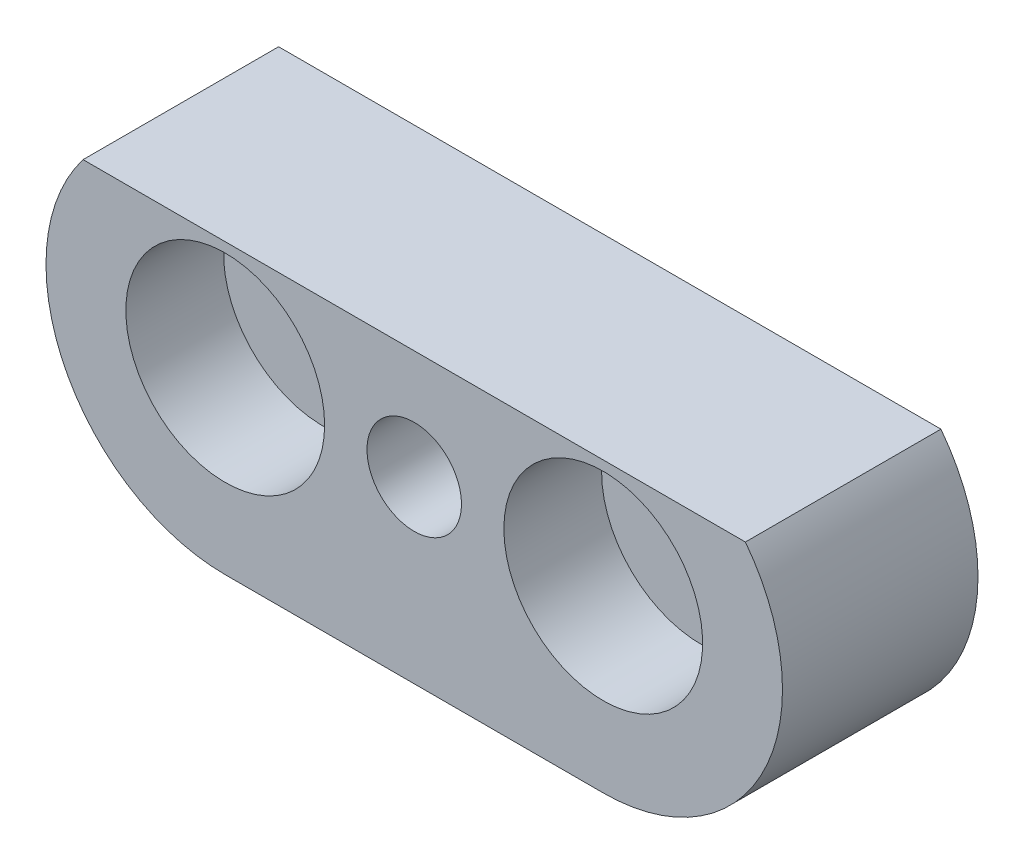
ISO-10303-21;
HEADER;
FILE_DESCRIPTION(('STEP AP214'),'2;1');
FILE_NAME('part.step','',(''),(''),'','','');
FILE_SCHEMA(('AUTOMOTIVE_DESIGN { 1 0 10303 214 1 1 1 1 }'));
ENDSEC;
DATA;
#1=APPLICATION_CONTEXT('core data for automotive mechanical design processes');
#2=APPLICATION_PROTOCOL_DEFINITION('international standard','automotive_design',2000,#1);
#3=PRODUCT_CONTEXT('',#1,'mechanical');
#4=PRODUCT('Part','Part','',(#3));
#5=PRODUCT_RELATED_PRODUCT_CATEGORY('part','',(#4));
#6=PRODUCT_DEFINITION_FORMATION('','',#4);
#7=PRODUCT_DEFINITION_CONTEXT('part definition',#1,'design');
#8=PRODUCT_DEFINITION('design','',#6,#7);
#9=PRODUCT_DEFINITION_SHAPE('','',#8);
#10=(LENGTH_UNIT() NAMED_UNIT(*) SI_UNIT(.MILLI.,.METRE.));
#11=(NAMED_UNIT(*) PLANE_ANGLE_UNIT() SI_UNIT($,.RADIAN.));
#12=(NAMED_UNIT(*) SI_UNIT($,.STERADIAN.) SOLID_ANGLE_UNIT());
#13=UNCERTAINTY_MEASURE_WITH_UNIT(LENGTH_MEASURE(1.E-05),#10,'distance_accuracy_value','');
#14=(GEOMETRIC_REPRESENTATION_CONTEXT(3) GLOBAL_UNCERTAINTY_ASSIGNED_CONTEXT((#13)) GLOBAL_UNIT_ASSIGNED_CONTEXT((#10,
#11,#12)) REPRESENTATION_CONTEXT('',''));
#15=CARTESIAN_POINT('',(0.,0.,0.));
#16=DIRECTION('',(0.,0.,1.));
#17=DIRECTION('',(1.,0.,0.));
#18=AXIS2_PLACEMENT_3D('',#15,#16,#17);
#19=CARTESIAN_POINT('',(-5.8,3.34999999999999,0.));
#20=DIRECTION('',(0.,0.,1.));
#21=DIRECTION('',(1.,0.,0.));
#22=AXIS2_PLACEMENT_3D('',#19,#20,#21);
#23=PLANE('',#22);
#24=CARTESIAN_POINT('',(-5.8,3.34999999999999,0.));
#25=DIRECTION('',(0.,0.,1.));
#26=DIRECTION('',(1.,0.,0.));
#27=AXIS2_PLACEMENT_3D('',#24,#25,#26);
#28=CIRCLE('',#27,3.1);
#29=CARTESIAN_POINT('',(-2.7,3.34999999999999,0.));
#30=VERTEX_POINT('',#29);
#31=EDGE_CURVE('E159',#30,#30,#28,.T.);
#32=ORIENTED_EDGE('',*,*,#31,.T.);
#33=EDGE_LOOP('',(#32));
#34=FACE_BOUND('',#33,.T.);
#35=CARTESIAN_POINT('',(5.8,3.34999999999999,0.));
#36=DIRECTION('',(0.,0.,-1.));
#37=DIRECTION('',(-1.,0.,0.));
#38=AXIS2_PLACEMENT_3D('',#35,#36,#37);
#39=CIRCLE('',#38,3.1);
#40=CARTESIAN_POINT('',(2.7,3.34999999999999,0.));
#41=VERTEX_POINT('',#40);
#42=EDGE_CURVE('E154',#41,#41,#39,.T.);
#43=ORIENTED_EDGE('',*,*,#42,.F.);
#44=EDGE_LOOP('',(#43));
#45=FACE_BOUND('',#44,.T.);
#46=CARTESIAN_POINT('',(0.,3.34999999999999,0.));
#47=DIRECTION('',(0.,0.,1.));
#48=DIRECTION('',(1.,0.,0.));
#49=AXIS2_PLACEMENT_3D('',#46,#47,#48);
#50=CIRCLE('',#49,1.45);
#51=CARTESIAN_POINT('',(1.45,3.34999999999999,0.));
#52=VERTEX_POINT('',#51);
#53=EDGE_CURVE('E138',#52,#52,#50,.T.);
#54=ORIENTED_EDGE('',*,*,#53,.T.);
#55=EDGE_LOOP('',(#54));
#56=FACE_BOUND('',#55,.T.);
#57=CARTESIAN_POINT('',(-5.8,3.34999999999999,0.));
#58=DIRECTION('',(0.,0.,1.));
#59=DIRECTION('',(1.,0.,0.));
#60=AXIS2_PLACEMENT_3D('',#57,#58,#59);
#61=CIRCLE('',#60,5.5);
#62=CARTESIAN_POINT('',(-5.8,-2.15000000000001,0.));
#63=VERTEX_POINT('',#62);
#64=CARTESIAN_POINT('',(-10.1620522692878,6.7000000000001,0.));
#65=VERTEX_POINT('',#64);
#66=EDGE_CURVE('E130',#63,#65,#61,.F.);
#67=ORIENTED_EDGE('',*,*,#66,.T.);
#68=DIRECTION('',(-1.,0.,0.));
#69=VECTOR('',#68,1.);
#70=CARTESIAN_POINT('',(-10.1620522692878,6.7000000000001,0.));
#71=LINE('',#70,#69);
#72=CARTESIAN_POINT('',(10.1620522692878,6.7000000000001,0.));
#73=VERTEX_POINT('',#72);
#74=EDGE_CURVE('E78',#73,#65,#71,.T.);
#75=ORIENTED_EDGE('',*,*,#74,.F.);
#76=CARTESIAN_POINT('',(5.8,3.34999999999999,0.));
#77=DIRECTION('',(0.,0.,1.));
#78=DIRECTION('',(1.,0.,0.));
#79=AXIS2_PLACEMENT_3D('',#76,#77,#78);
#80=CIRCLE('',#79,5.5);
#81=CARTESIAN_POINT('',(5.8,-2.15000000000001,0.));
#82=VERTEX_POINT('',#81);
#83=EDGE_CURVE('E136',#73,#82,#80,.F.);
#84=ORIENTED_EDGE('',*,*,#83,.T.);
#85=DIRECTION('',(-1.,0.,0.));
#86=VECTOR('',#85,1.);
#87=CARTESIAN_POINT('',(-5.8,-2.15000000000001,0.));
#88=LINE('',#87,#86);
#89=EDGE_CURVE('E86',#82,#63,#88,.T.);
#90=ORIENTED_EDGE('',*,*,#89,.T.);
#91=EDGE_LOOP('',(#67,#75,#84,#90));
#92=FACE_BOUND('',#91,.T.);
#93=ADVANCED_FACE('F63',(#34,#45,#56,#92),#23,.F.);
#94=CARTESIAN_POINT('',(-5.8,3.34999999999999,2.));
#95=DIRECTION('',(0.,0.,-1.));
#96=DIRECTION('',(-1.,0.,0.));
#97=AXIS2_PLACEMENT_3D('',#94,#95,#96);
#98=CYLINDRICAL_SURFACE('',#97,3.1);
#99=CARTESIAN_POINT('',(-5.8,3.34999999999999,1.));
#100=DIRECTION('',(0.,0.,1.));
#101=DIRECTION('',(1.,0.,0.));
#102=AXIS2_PLACEMENT_3D('',#99,#100,#101);
#103=CIRCLE('',#102,3.1);
#104=CARTESIAN_POINT('',(-2.7,3.34999999999999,1.));
#105=VERTEX_POINT('',#104);
#106=EDGE_CURVE('E162',#105,#105,#103,.T.);
#107=ORIENTED_EDGE('',*,*,#106,.T.);
#108=EDGE_LOOP('',(#107));
#109=FACE_BOUND('',#108,.T.);
#110=ORIENTED_EDGE('',*,*,#31,.F.);
#111=EDGE_LOOP('',(#110));
#112=FACE_BOUND('',#111,.T.);
#113=ADVANCED_FACE('F187',(#109,#112),#98,.F.);
#114=CARTESIAN_POINT('',(-5.8,3.34999999999999,2.));
#115=DIRECTION('',(0.,0.,1.));
#116=DIRECTION('',(1.,0.,0.));
#117=AXIS2_PLACEMENT_3D('',#114,#115,#116);
#118=PLANE('',#117);
#119=CARTESIAN_POINT('',(-5.8,3.34999999999999,2.));
#120=DIRECTION('',(0.,0.,1.));
#121=DIRECTION('',(1.,0.,0.));
#122=AXIS2_PLACEMENT_3D('',#119,#120,#121);
#123=CIRCLE('',#122,2.1);
#124=CARTESIAN_POINT('',(-3.7,3.34999999999999,2.));
#125=VERTEX_POINT('',#124);
#126=EDGE_CURVE('E165',#125,#125,#123,.F.);
#127=ORIENTED_EDGE('',*,*,#126,.T.);
#128=EDGE_LOOP('',(#127));
#129=FACE_BOUND('',#128,.T.);
#130=ADVANCED_FACE('F193',(#129),#118,.F.);
#131=CARTESIAN_POINT('',(-5.8,3.34999999999999,6.));
#132=DIRECTION('',(0.,0.,1.));
#133=DIRECTION('',(1.,0.,0.));
#134=AXIS2_PLACEMENT_3D('',#131,#132,#133);
#135=PLANE('',#134);
#136=DIRECTION('',(1.,0.,0.));
#137=VECTOR('',#136,1.);
#138=CARTESIAN_POINT('',(-10.1620522692878,6.7000000000001,6.));
#139=LINE('',#138,#137);
#140=CARTESIAN_POINT('',(-10.1620522692878,6.7000000000001,6.));
#141=VERTEX_POINT('',#140);
#142=CARTESIAN_POINT('',(10.1620522692878,6.7000000000001,6.));
#143=VERTEX_POINT('',#142);
#144=EDGE_CURVE('E105',#141,#143,#139,.T.);
#145=ORIENTED_EDGE('',*,*,#144,.F.);
#146=CARTESIAN_POINT('',(-5.8,3.34999999999999,6.));
#147=DIRECTION('',(0.,0.,1.));
#148=DIRECTION('',(1.,0.,0.));
#149=AXIS2_PLACEMENT_3D('',#146,#147,#148);
#150=CIRCLE('',#149,5.5);
#151=CARTESIAN_POINT('',(-5.8,-2.15000000000001,6.));
#152=VERTEX_POINT('',#151);
#153=EDGE_CURVE('E116',#141,#152,#150,.T.);
#154=ORIENTED_EDGE('',*,*,#153,.T.);
#155=DIRECTION('',(1.,0.,0.));
#156=VECTOR('',#155,1.);
#157=CARTESIAN_POINT('',(-5.8,-2.15000000000001,6.));
#158=LINE('',#157,#156);
#159=CARTESIAN_POINT('',(5.8,-2.15000000000001,6.));
#160=VERTEX_POINT('',#159);
#161=EDGE_CURVE('E125',#152,#160,#158,.T.);
#162=ORIENTED_EDGE('',*,*,#161,.T.);
#163=CARTESIAN_POINT('',(5.8,3.34999999999999,6.));
#164=DIRECTION('',(0.,0.,1.));
#165=DIRECTION('',(1.,0.,0.));
#166=AXIS2_PLACEMENT_3D('',#163,#164,#165);
#167=CIRCLE('',#166,5.5);
#168=EDGE_CURVE('E119',#160,#143,#167,.T.);
#169=ORIENTED_EDGE('',*,*,#168,.T.);
#170=EDGE_LOOP('',(#145,#154,#162,#169));
#171=FACE_BOUND('',#170,.T.);
#172=CARTESIAN_POINT('',(0.,3.34999999999999,6.));
#173=DIRECTION('',(0.,0.,1.));
#174=DIRECTION('',(1.,0.,0.));
#175=AXIS2_PLACEMENT_3D('',#172,#173,#174);
#176=CIRCLE('',#175,1.45);
#177=CARTESIAN_POINT('',(1.45,3.34999999999999,6.));
#178=VERTEX_POINT('',#177);
#179=EDGE_CURVE('E141',#178,#178,#176,.T.);
#180=ORIENTED_EDGE('',*,*,#179,.F.);
#181=EDGE_LOOP('',(#180));
#182=FACE_BOUND('',#181,.T.);
#183=CARTESIAN_POINT('',(5.8,3.34999999999999,6.));
#184=DIRECTION('',(0.,0.,-1.));
#185=DIRECTION('',(-1.,0.,0.));
#186=AXIS2_PLACEMENT_3D('',#183,#184,#185);
#187=CIRCLE('',#186,3.05);
#188=CARTESIAN_POINT('',(2.75,3.34999999999999,6.));
#189=VERTEX_POINT('',#188);
#190=EDGE_CURVE('E144',#189,#189,#187,.T.);
#191=ORIENTED_EDGE('',*,*,#190,.T.);
#192=EDGE_LOOP('',(#191));
#193=FACE_BOUND('',#192,.T.);
#194=CARTESIAN_POINT('',(-5.8,3.34999999999999,6.));
#195=DIRECTION('',(0.,0.,1.));
#196=DIRECTION('',(1.,0.,0.));
#197=AXIS2_PLACEMENT_3D('',#194,#195,#196);
#198=CIRCLE('',#197,3.05);
#199=CARTESIAN_POINT('',(-2.75,3.34999999999999,6.));
#200=VERTEX_POINT('',#199);
#201=EDGE_CURVE('E148',#200,#200,#198,.T.);
#202=ORIENTED_EDGE('',*,*,#201,.F.);
#203=EDGE_LOOP('',(#202));
#204=FACE_BOUND('',#203,.T.);
#205=ADVANCED_FACE('F113',(#171,#182,#193,#204),#135,.T.);
#206=CARTESIAN_POINT('',(5.8,3.34999999999999,2.));
#207=DIRECTION('',(0.,0.,-1.));
#208=DIRECTION('',(1.,0.,0.));
#209=AXIS2_PLACEMENT_3D('',#206,#207,#208);
#210=CYLINDRICAL_SURFACE('',#209,3.1);
#211=CARTESIAN_POINT('',(5.8,3.34999999999999,1.));
#212=DIRECTION('',(0.,0.,1.));
#213=DIRECTION('',(1.,0.,0.));
#214=AXIS2_PLACEMENT_3D('',#211,#212,#213);
#215=CIRCLE('',#214,3.1);
#216=CARTESIAN_POINT('',(8.9,3.34999999999999,1.));
#217=VERTEX_POINT('',#216);
#218=EDGE_CURVE('E12',#217,#217,#215,.T.);
#219=ORIENTED_EDGE('',*,*,#218,.T.);
#220=EDGE_LOOP('',(#219));
#221=FACE_BOUND('',#220,.T.);
#222=ORIENTED_EDGE('',*,*,#42,.T.);
#223=EDGE_LOOP('',(#222));
#224=FACE_BOUND('',#223,.T.);
#225=ADVANCED_FACE('F203',(#221,#224),#210,.F.);
#226=CARTESIAN_POINT('',(5.8,3.34999999999999,2.));
#227=DIRECTION('',(0.,0.,1.));
#228=DIRECTION('',(1.,0.,0.));
#229=AXIS2_PLACEMENT_3D('',#226,#227,#228);
#230=CIRCLE('',#229,2.1);
#231=CARTESIAN_POINT('',(7.9,3.34999999999999,2.));
#232=VERTEX_POINT('',#231);
#233=EDGE_CURVE('E71',#232,#232,#230,.F.);
#234=ORIENTED_EDGE('',*,*,#233,.T.);
#235=EDGE_LOOP('',(#234));
#236=FACE_BOUND('',#235,.T.);
#237=ADVANCED_FACE('F170',(#236),#118,.F.);
#238=CARTESIAN_POINT('',(-5.8,3.34999999999999,3.));
#239=DIRECTION('',(0.,0.,1.));
#240=DIRECTION('',(1.,0.,0.));
#241=AXIS2_PLACEMENT_3D('',#238,#239,#240);
#242=CYLINDRICAL_SURFACE('',#241,3.05);
#243=CARTESIAN_POINT('',(-5.8,3.34999999999999,3.));
#244=DIRECTION('',(0.,0.,1.));
#245=DIRECTION('',(1.,0.,0.));
#246=AXIS2_PLACEMENT_3D('',#243,#244,#245);
#247=CIRCLE('',#246,3.05);
#248=CARTESIAN_POINT('',(-2.75,3.34999999999999,3.));
#249=VERTEX_POINT('',#248);
#250=EDGE_CURVE('E151',#249,#249,#247,.T.);
#251=ORIENTED_EDGE('',*,*,#250,.F.);
#252=EDGE_LOOP('',(#251));
#253=FACE_BOUND('',#252,.T.);
#254=ORIENTED_EDGE('',*,*,#201,.T.);
#255=EDGE_LOOP('',(#254));
#256=FACE_BOUND('',#255,.T.);
#257=ADVANCED_FACE('F207',(#253,#256),#242,.F.);
#258=CARTESIAN_POINT('',(-5.8,3.34999999999999,3.));
#259=DIRECTION('',(0.,0.,1.));
#260=DIRECTION('',(1.,0.,0.));
#261=AXIS2_PLACEMENT_3D('',#258,#259,#260);
#262=PLANE('',#261);
#263=ORIENTED_EDGE('',*,*,#250,.T.);
#264=EDGE_LOOP('',(#263));
#265=FACE_BOUND('',#264,.T.);
#266=ADVANCED_FACE('F210',(#265),#262,.T.);
#267=CARTESIAN_POINT('',(5.8,3.34999999999999,3.));
#268=DIRECTION('',(0.,0.,1.));
#269=DIRECTION('',(1.,0.,0.));
#270=AXIS2_PLACEMENT_3D('',#267,#268,#269);
#271=CYLINDRICAL_SURFACE('',#270,3.05);
#272=CARTESIAN_POINT('',(5.8,3.34999999999999,3.));
#273=DIRECTION('',(0.,0.,-1.));
#274=DIRECTION('',(-1.,0.,0.));
#275=AXIS2_PLACEMENT_3D('',#272,#273,#274);
#276=CIRCLE('',#275,3.05);
#277=CARTESIAN_POINT('',(2.75,3.34999999999999,3.));
#278=VERTEX_POINT('',#277);
#279=EDGE_CURVE('E145',#278,#278,#276,.T.);
#280=ORIENTED_EDGE('',*,*,#279,.T.);
#281=EDGE_LOOP('',(#280));
#282=FACE_BOUND('',#281,.T.);
#283=ORIENTED_EDGE('',*,*,#190,.F.);
#284=EDGE_LOOP('',(#283));
#285=FACE_BOUND('',#284,.T.);
#286=ADVANCED_FACE('F214',(#282,#285),#271,.F.);
#287=CARTESIAN_POINT('',(5.8,3.34999999999999,3.));
#288=DIRECTION('',(0.,0.,1.));
#289=DIRECTION('',(-1.,0.,0.));
#290=AXIS2_PLACEMENT_3D('',#287,#288,#289);
#291=PLANE('',#290);
#292=ORIENTED_EDGE('',*,*,#279,.F.);
#293=EDGE_LOOP('',(#292));
#294=FACE_BOUND('',#293,.T.);
#295=ADVANCED_FACE('F218',(#294),#291,.T.);
#296=CARTESIAN_POINT('',(0.,3.34999999999999,-0.00100000000000013));
#297=DIRECTION('',(0.,0.,1.));
#298=DIRECTION('',(1.,0.,0.));
#299=AXIS2_PLACEMENT_3D('',#296,#297,#298);
#300=CYLINDRICAL_SURFACE('',#299,1.45);
#301=CARTESIAN_POINT('',(1.45,3.34999999999999,6.));
#302=CARTESIAN_POINT('',(1.45,3.34999999999999,5.9375));
#303=CARTESIAN_POINT('',(1.45,3.34999999999999,5.875));
#304=CARTESIAN_POINT('',(1.45,3.34999999999999,5.75));
#305=CARTESIAN_POINT('',(1.45,3.34999999999999,5.6875));
#306=CARTESIAN_POINT('',(1.45,3.34999999999999,5.5625));
#307=CARTESIAN_POINT('',(1.45,3.34999999999999,5.5));
#308=CARTESIAN_POINT('',(1.45,3.34999999999999,5.375));
#309=CARTESIAN_POINT('',(1.45,3.34999999999999,5.3125));
#310=CARTESIAN_POINT('',(1.45,3.34999999999999,5.1875));
#311=CARTESIAN_POINT('',(1.45,3.34999999999999,5.125));
#312=CARTESIAN_POINT('',(1.45,3.34999999999999,5.));
#313=CARTESIAN_POINT('',(1.45,3.34999999999999,4.9375));
#314=CARTESIAN_POINT('',(1.45,3.34999999999999,4.8125));
#315=CARTESIAN_POINT('',(1.45,3.34999999999999,4.75));
#316=CARTESIAN_POINT('',(1.45,3.34999999999999,4.625));
#317=CARTESIAN_POINT('',(1.45,3.34999999999999,4.5625));
#318=CARTESIAN_POINT('',(1.45,3.34999999999999,4.4375));
#319=CARTESIAN_POINT('',(1.45,3.34999999999999,4.375));
#320=CARTESIAN_POINT('',(1.45,3.34999999999999,4.25));
#321=CARTESIAN_POINT('',(1.45,3.34999999999999,4.1875));
#322=CARTESIAN_POINT('',(1.45,3.34999999999999,4.0625));
#323=CARTESIAN_POINT('',(1.45,3.34999999999999,4.));
#324=CARTESIAN_POINT('',(1.45,3.34999999999999,3.875));
#325=CARTESIAN_POINT('',(1.45,3.34999999999999,3.8125));
#326=CARTESIAN_POINT('',(1.45,3.34999999999999,3.6875));
#327=CARTESIAN_POINT('',(1.45,3.34999999999999,3.625));
#328=CARTESIAN_POINT('',(1.45,3.34999999999999,3.5));
#329=CARTESIAN_POINT('',(1.45,3.34999999999999,3.4375));
#330=CARTESIAN_POINT('',(1.45,3.34999999999999,3.3125));
#331=CARTESIAN_POINT('',(1.45,3.34999999999999,3.25));
#332=CARTESIAN_POINT('',(1.45,3.34999999999999,3.125));
#333=CARTESIAN_POINT('',(1.45,3.34999999999999,3.0625));
#334=CARTESIAN_POINT('',(1.45,3.34999999999999,2.9375));
#335=CARTESIAN_POINT('',(1.45,3.34999999999999,2.875));
#336=CARTESIAN_POINT('',(1.45,3.34999999999999,2.75));
#337=CARTESIAN_POINT('',(1.45,3.34999999999999,2.6875));
#338=CARTESIAN_POINT('',(1.45,3.34999999999999,2.5625));
#339=CARTESIAN_POINT('',(1.45,3.34999999999999,2.5));
#340=CARTESIAN_POINT('',(1.45,3.34999999999999,2.375));
#341=CARTESIAN_POINT('',(1.45,3.34999999999999,2.3125));
#342=CARTESIAN_POINT('',(1.45,3.34999999999999,2.1875));
#343=CARTESIAN_POINT('',(1.45,3.34999999999999,2.125));
#344=CARTESIAN_POINT('',(1.45,3.34999999999999,2.));
#345=CARTESIAN_POINT('',(1.45,3.34999999999999,1.9375));
#346=CARTESIAN_POINT('',(1.45,3.34999999999999,1.8125));
#347=CARTESIAN_POINT('',(1.45,3.34999999999999,1.75));
#348=CARTESIAN_POINT('',(1.45,3.34999999999999,1.625));
#349=CARTESIAN_POINT('',(1.45,3.34999999999999,1.5625));
#350=CARTESIAN_POINT('',(1.45,3.34999999999999,1.4375));
#351=CARTESIAN_POINT('',(1.45,3.34999999999999,1.375));
#352=CARTESIAN_POINT('',(1.45,3.34999999999999,1.25));
#353=CARTESIAN_POINT('',(1.45,3.34999999999999,1.1875));
#354=CARTESIAN_POINT('',(1.45,3.34999999999999,1.0625));
#355=CARTESIAN_POINT('',(1.45,3.34999999999999,1.));
#356=CARTESIAN_POINT('',(1.45,3.34999999999999,0.875000000000002));
#357=CARTESIAN_POINT('',(1.45,3.34999999999999,0.812500000000001));
#358=CARTESIAN_POINT('',(1.45,3.34999999999999,0.687500000000001));
#359=CARTESIAN_POINT('',(1.45,3.34999999999999,0.625000000000001));
#360=CARTESIAN_POINT('',(1.45,3.34999999999999,0.500000000000002));
#361=CARTESIAN_POINT('',(1.45,3.34999999999999,0.437500000000002));
#362=CARTESIAN_POINT('',(1.45,3.34999999999999,0.312500000000002));
#363=CARTESIAN_POINT('',(1.45,3.34999999999999,0.250000000000002));
#364=CARTESIAN_POINT('',(1.45,3.34999999999999,0.125000000000002));
#365=CARTESIAN_POINT('',(1.45,3.34999999999999,0.0625000000000019));
#366=CARTESIAN_POINT('',(1.45,3.34999999999999,0.));
#367=B_SPLINE_CURVE_WITH_KNOTS('',3,(#301,#302,#303,#304,#305,#306,#307,#308,#309,#310,#311,
#312,#313,#314,#315,#316,#317,#318,#319,#320,#321,#322,#323,#324,#325,#326,#327,#328,#329,#330,
#331,#332,#333,#334,#335,#336,#337,#338,#339,#340,#341,#342,#343,#344,#345,#346,#347,#348,#349,
#350,#351,#352,#353,#354,#355,#356,#357,#358,#359,#360,#361,#362,#363,#364,#365,#366),
.UNSPECIFIED.,.F.,.F.,(4,2,2,2,2,2,2,2,2,2,2,2,2,2,2,2,2,2,2,2,2,2,2,2,2,2,2,2,2,2,2,2,4),(0.,
0.1875,0.375,0.5625,0.75,0.9375,1.125,1.3125,1.5,1.6875,1.875,2.0625,2.25,2.4375,2.625,2.8125,
3.,3.1875,3.375,3.5625,3.75,3.9375,4.125,4.3125,4.5,4.6875,4.875,5.0625,5.25,5.4375,5.625,
5.8125,6.),.UNSPECIFIED.);
#368=EDGE_CURVE('BSEAM183',#178,#52,#367,.T.);
#369=ORIENTED_EDGE('',*,*,#179,.T.);
#370=ORIENTED_EDGE('',*,*,#53,.F.);
#371=ORIENTED_EDGE('',*,*,#368,.T.);
#372=ORIENTED_EDGE('',*,*,#368,.F.);
#373=EDGE_LOOP('',(#369,#371,#370,#372));
#374=FACE_BOUND('',#373,.T.);
#375=ADVANCED_FACE('F183',(#374),#300,.F.);
#376=CARTESIAN_POINT('',(-5.8,3.34999999999999,1.));
#377=DIRECTION('',(0.,0.,1.));
#378=DIRECTION('',(1.,0.,0.));
#379=AXIS2_PLACEMENT_3D('',#376,#377,#378);
#380=TOROIDAL_SURFACE('',#379,2.1,1.);
#381=ORIENTED_EDGE('',*,*,#126,.F.);
#382=EDGE_LOOP('',(#381));
#383=FACE_BOUND('',#382,.T.);
#384=ORIENTED_EDGE('',*,*,#106,.F.);
#385=EDGE_LOOP('',(#384));
#386=FACE_BOUND('',#385,.T.);
#387=ADVANCED_FACE('F174',(#383,#386),#380,.F.);
#388=CARTESIAN_POINT('',(5.8,3.34999999999999,1.));
#389=DIRECTION('',(0.,0.,1.));
#390=DIRECTION('',(1.,0.,0.));
#391=AXIS2_PLACEMENT_3D('',#388,#389,#390);
#392=TOROIDAL_SURFACE('',#391,2.1,1.);
#393=ORIENTED_EDGE('',*,*,#218,.F.);
#394=EDGE_LOOP('',(#393));
#395=FACE_BOUND('',#394,.T.);
#396=ORIENTED_EDGE('',*,*,#233,.F.);
#397=EDGE_LOOP('',(#396));
#398=FACE_BOUND('',#397,.T.);
#399=ADVANCED_FACE('F65',(#395,#398),#392,.F.);
#400=CARTESIAN_POINT('',(-5.8,-2.15000000000001,-25.1348363829964));
#401=DIRECTION('',(0.,-1.,0.));
#402=DIRECTION('',(0.,0.,-1.));
#403=AXIS2_PLACEMENT_3D('',#400,#401,#402);
#404=PLANE('',#403);
#405=ORIENTED_EDGE('',*,*,#89,.F.);
#406=DIRECTION('',(0.,0.,1.));
#407=VECTOR('',#406,1.);
#408=CARTESIAN_POINT('',(5.8,-2.15000000000001,-25.1348363829964));
#409=LINE('',#408,#407);
#410=EDGE_CURVE('E134',#82,#160,#409,.T.);
#411=ORIENTED_EDGE('',*,*,#410,.T.);
#412=ORIENTED_EDGE('',*,*,#161,.F.);
#413=DIRECTION('',(0.,0.,1.));
#414=VECTOR('',#413,1.);
#415=CARTESIAN_POINT('',(-5.8,-2.15000000000001,-25.1348363829964));
#416=LINE('',#415,#414);
#417=EDGE_CURVE('E123',#63,#152,#416,.T.);
#418=ORIENTED_EDGE('',*,*,#417,.F.);
#419=EDGE_LOOP('',(#405,#411,#412,#418));
#420=FACE_BOUND('',#419,.T.);
#421=ADVANCED_FACE('F173',(#420),#404,.T.);
#422=CARTESIAN_POINT('',(5.8,3.34999999999999,-25.1348363829964));
#423=DIRECTION('',(0.,0.,1.));
#424=DIRECTION('',(1.,0.,0.));
#425=AXIS2_PLACEMENT_3D('',#422,#423,#424);
#426=CYLINDRICAL_SURFACE('',#425,5.5);
#427=DIRECTION('',(0.,0.,1.));
#428=VECTOR('',#427,1.);
#429=CARTESIAN_POINT('',(10.1620522692878,6.7000000000001,-0.00100000000000013));
#430=LINE('',#429,#428);
#431=EDGE_CURVE('E109',#73,#143,#430,.T.);
#432=ORIENTED_EDGE('',*,*,#431,.T.);
#433=ORIENTED_EDGE('',*,*,#168,.F.);
#434=ORIENTED_EDGE('',*,*,#410,.F.);
#435=ORIENTED_EDGE('',*,*,#83,.F.);
#436=EDGE_LOOP('',(#432,#433,#434,#435));
#437=FACE_BOUND('',#436,.T.);
#438=ADVANCED_FACE('F180',(#437),#426,.T.);
#439=CARTESIAN_POINT('',(-5.8,3.34999999999999,-25.1348363829964));
#440=DIRECTION('',(0.,0.,1.));
#441=DIRECTION('',(1.,0.,0.));
#442=AXIS2_PLACEMENT_3D('',#439,#440,#441);
#443=CYLINDRICAL_SURFACE('',#442,5.5);
#444=DIRECTION('',(0.,0.,1.));
#445=VECTOR('',#444,1.);
#446=CARTESIAN_POINT('',(-10.1620522692878,6.7000000000001,-0.00100000000000013));
#447=LINE('',#446,#445);
#448=EDGE_CURVE('E102',#65,#141,#447,.T.);
#449=ORIENTED_EDGE('',*,*,#448,.F.);
#450=ORIENTED_EDGE('',*,*,#66,.F.);
#451=ORIENTED_EDGE('',*,*,#417,.T.);
#452=ORIENTED_EDGE('',*,*,#153,.F.);
#453=EDGE_LOOP('',(#449,#450,#451,#452));
#454=FACE_BOUND('',#453,.T.);
#455=ADVANCED_FACE('F121',(#454),#443,.T.);
#456=CARTESIAN_POINT('',(-10.1620522692878,6.7000000000001,-0.00100000000000013));
#457=DIRECTION('',(0.,-1.,0.));
#458=DIRECTION('',(0.,0.,-1.));
#459=AXIS2_PLACEMENT_3D('',#456,#457,#458);
#460=PLANE('',#459);
#461=ORIENTED_EDGE('',*,*,#74,.T.);
#462=ORIENTED_EDGE('',*,*,#448,.T.);
#463=ORIENTED_EDGE('',*,*,#144,.T.);
#464=ORIENTED_EDGE('',*,*,#431,.F.);
#465=EDGE_LOOP('',(#461,#462,#463,#464));
#466=FACE_BOUND('',#465,.T.);
#467=ADVANCED_FACE('F104',(#466),#460,.F.);
#468=CLOSED_SHELL('',(#93,#113,#130,#205,#225,#237,#257,#266,#286,#295,#375,#387,#399,#421,#438,
#455,#467));
#469=MANIFOLD_SOLID_BREP('B2',#468);
#470=ADVANCED_BREP_SHAPE_REPRESENTATION('',(#18,#469),#14);
#471=SHAPE_DEFINITION_REPRESENTATION(#9,#470);
ENDSEC;
END-ISO-10303-21;
